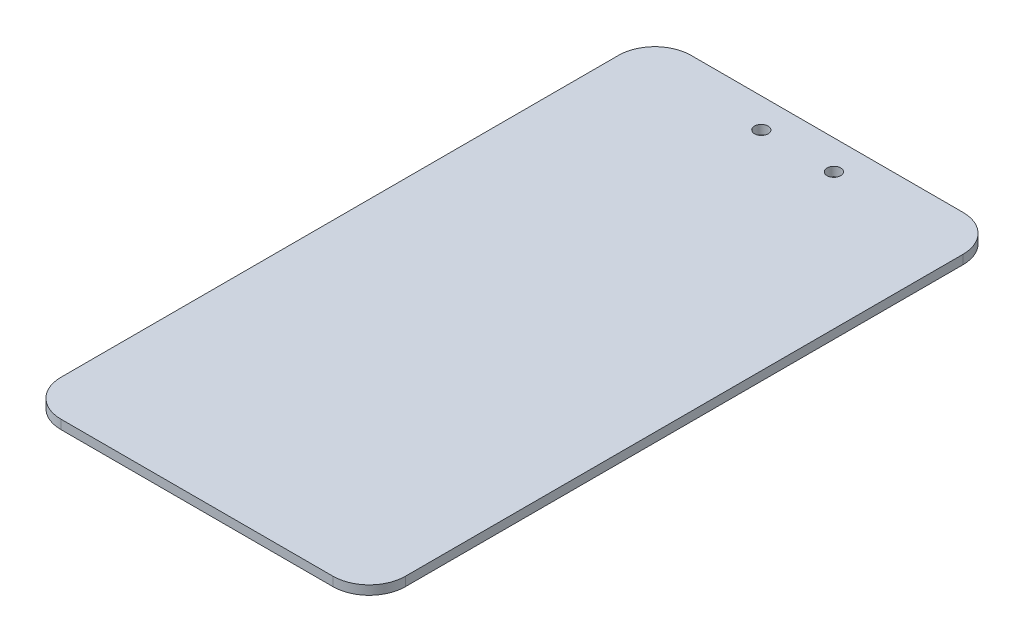
ISO-10303-21;
HEADER;
FILE_DESCRIPTION(('STEP AP214'),'2;1');
FILE_NAME('part.step','',(''),(''),'','','');
FILE_SCHEMA(('AUTOMOTIVE_DESIGN { 1 0 10303 214 1 1 1 1 }'));
ENDSEC;
DATA;
#1=APPLICATION_CONTEXT('core data for automotive mechanical design processes');
#2=APPLICATION_PROTOCOL_DEFINITION('international standard','automotive_design',2000,#1);
#3=PRODUCT_CONTEXT('',#1,'mechanical');
#4=PRODUCT('Part','Part','',(#3));
#5=PRODUCT_RELATED_PRODUCT_CATEGORY('part','',(#4));
#6=PRODUCT_DEFINITION_FORMATION('','',#4);
#7=PRODUCT_DEFINITION_CONTEXT('part definition',#1,'design');
#8=PRODUCT_DEFINITION('design','',#6,#7);
#9=PRODUCT_DEFINITION_SHAPE('','',#8);
#10=(LENGTH_UNIT() NAMED_UNIT(*) SI_UNIT(.MILLI.,.METRE.));
#11=(NAMED_UNIT(*) PLANE_ANGLE_UNIT() SI_UNIT($,.RADIAN.));
#12=(NAMED_UNIT(*) SI_UNIT($,.STERADIAN.) SOLID_ANGLE_UNIT());
#13=UNCERTAINTY_MEASURE_WITH_UNIT(LENGTH_MEASURE(1.E-05),#10,'distance_accuracy_value','');
#14=(GEOMETRIC_REPRESENTATION_CONTEXT(3) GLOBAL_UNCERTAINTY_ASSIGNED_CONTEXT((#13)) GLOBAL_UNIT_ASSIGNED_CONTEXT((#10,
#11,#12)) REPRESENTATION_CONTEXT('',''));
#15=CARTESIAN_POINT('',(0.,0.,0.));
#16=DIRECTION('',(0.,0.,1.));
#17=DIRECTION('',(1.,0.,0.));
#18=AXIS2_PLACEMENT_3D('',#15,#16,#17);
#19=CARTESIAN_POINT('',(8.,2.,-8.));
#20=DIRECTION('',(0.,-1.,0.));
#21=DIRECTION('',(0.,0.,-1.));
#22=AXIS2_PLACEMENT_3D('',#19,#20,#21);
#23=PLANE('',#22);
#24=CARTESIAN_POINT('',(8.,2.,-8.));
#25=DIRECTION('',(0.,1.,0.));
#26=DIRECTION('',(0.,0.,-1.));
#27=AXIS2_PLACEMENT_3D('',#24,#25,#26);
#28=CIRCLE('',#27,8.);
#29=CARTESIAN_POINT('',(0.,2.,-8.00000000000006));
#30=VERTEX_POINT('',#29);
#31=CARTESIAN_POINT('',(8.00000000000006,2.,0.));
#32=VERTEX_POINT('',#31);
#33=EDGE_CURVE('E170',#30,#32,#28,.T.);
#34=ORIENTED_EDGE('',*,*,#33,.T.);
#35=DIRECTION('',(1.,0.,0.));
#36=VECTOR('',#35,1.);
#37=CARTESIAN_POINT('',(8.00000000000006,2.,0.));
#38=LINE('',#37,#36);
#39=CARTESIAN_POINT('',(67.9999999999999,2.,0.));
#40=VERTEX_POINT('',#39);
#41=EDGE_CURVE('E106',#32,#40,#38,.T.);
#42=ORIENTED_EDGE('',*,*,#41,.T.);
#43=CARTESIAN_POINT('',(68.,2.,-8.));
#44=DIRECTION('',(0.,1.,0.));
#45=DIRECTION('',(0.,0.,1.));
#46=AXIS2_PLACEMENT_3D('',#43,#44,#45);
#47=CIRCLE('',#46,8.);
#48=CARTESIAN_POINT('',(76.,2.,-8.00000000000005));
#49=VERTEX_POINT('',#48);
#50=EDGE_CURVE('E191',#40,#49,#47,.T.);
#51=ORIENTED_EDGE('',*,*,#50,.T.);
#52=DIRECTION('',(0.,0.,-1.));
#53=VECTOR('',#52,1.);
#54=CARTESIAN_POINT('',(76.,2.,-8.00000000000006));
#55=LINE('',#54,#53);
#56=CARTESIAN_POINT('',(76.,2.,-131.));
#57=VERTEX_POINT('',#56);
#58=EDGE_CURVE('E205',#49,#57,#55,.T.);
#59=ORIENTED_EDGE('',*,*,#58,.T.);
#60=CARTESIAN_POINT('',(68.,2.,-131.));
#61=DIRECTION('',(0.,1.,0.));
#62=DIRECTION('',(0.,0.,-1.));
#63=AXIS2_PLACEMENT_3D('',#60,#61,#62);
#64=CIRCLE('',#63,8.);
#65=CARTESIAN_POINT('',(67.9999999999999,2.,-139.));
#66=VERTEX_POINT('',#65);
#67=EDGE_CURVE('E125',#57,#66,#64,.T.);
#68=ORIENTED_EDGE('',*,*,#67,.T.);
#69=DIRECTION('',(-1.,0.,0.));
#70=VECTOR('',#69,1.);
#71=CARTESIAN_POINT('',(8.00000000000006,2.,-139.));
#72=LINE('',#71,#70);
#73=CARTESIAN_POINT('',(8.00000000000006,2.,-139.));
#74=VERTEX_POINT('',#73);
#75=EDGE_CURVE('E119',#66,#74,#72,.T.);
#76=ORIENTED_EDGE('',*,*,#75,.T.);
#77=CARTESIAN_POINT('',(8.,2.,-131.));
#78=DIRECTION('',(0.,1.,0.));
#79=DIRECTION('',(0.,0.,-1.));
#80=AXIS2_PLACEMENT_3D('',#77,#78,#79);
#81=CIRCLE('',#80,8.);
#82=CARTESIAN_POINT('',(0.,2.,-131.));
#83=VERTEX_POINT('',#82);
#84=EDGE_CURVE('E123',#74,#83,#81,.T.);
#85=ORIENTED_EDGE('',*,*,#84,.T.);
#86=DIRECTION('',(0.,0.,1.));
#87=VECTOR('',#86,1.);
#88=CARTESIAN_POINT('',(0.,2.,-8.00000000000006));
#89=LINE('',#88,#87);
#90=EDGE_CURVE('E63',#83,#30,#89,.T.);
#91=ORIENTED_EDGE('',*,*,#90,.T.);
#92=EDGE_LOOP('',(#34,#42,#51,#59,#68,#76,#85,#91));
#93=FACE_BOUND('',#92,.T.);
#94=CARTESIAN_POINT('',(46.,2.,-132.5));
#95=DIRECTION('',(0.,1.,0.));
#96=DIRECTION('',(0.,0.,1.));
#97=AXIS2_PLACEMENT_3D('',#94,#95,#96);
#98=CIRCLE('',#97,1.5);
#99=CARTESIAN_POINT('',(46.,2.,-131.));
#100=VERTEX_POINT('',#99);
#101=EDGE_CURVE('E152',#100,#100,#98,.T.);
#102=ORIENTED_EDGE('',*,*,#101,.F.);
#103=EDGE_LOOP('',(#102));
#104=FACE_BOUND('',#103,.T.);
#105=CARTESIAN_POINT('',(30.,2.,-132.5));
#106=DIRECTION('',(0.,1.,0.));
#107=DIRECTION('',(0.,0.,-1.));
#108=AXIS2_PLACEMENT_3D('',#105,#106,#107);
#109=CIRCLE('',#108,1.5);
#110=CARTESIAN_POINT('',(30.,2.,-134.));
#111=VERTEX_POINT('',#110);
#112=EDGE_CURVE('E219',#111,#111,#109,.T.);
#113=ORIENTED_EDGE('',*,*,#112,.F.);
#114=EDGE_LOOP('',(#113));
#115=FACE_BOUND('',#114,.T.);
#116=ADVANCED_FACE('F45',(#93,#104,#115),#23,.F.);
#117=CARTESIAN_POINT('',(8.,0.,-8.));
#118=DIRECTION('',(0.,-1.,0.));
#119=DIRECTION('',(0.,0.,-1.));
#120=AXIS2_PLACEMENT_3D('',#117,#118,#119);
#121=PLANE('',#120);
#122=CARTESIAN_POINT('',(46.,0.,-132.5));
#123=DIRECTION('',(0.,1.,0.));
#124=DIRECTION('',(0.,0.,1.));
#125=AXIS2_PLACEMENT_3D('',#122,#123,#124);
#126=CIRCLE('',#125,1.5);
#127=CARTESIAN_POINT('',(46.,0.,-131.));
#128=VERTEX_POINT('',#127);
#129=EDGE_CURVE('E215',#128,#128,#126,.T.);
#130=ORIENTED_EDGE('',*,*,#129,.T.);
#131=EDGE_LOOP('',(#130));
#132=FACE_BOUND('',#131,.T.);
#133=CARTESIAN_POINT('',(8.,0.,-8.));
#134=DIRECTION('',(0.,1.,0.));
#135=DIRECTION('',(0.,0.,-1.));
#136=AXIS2_PLACEMENT_3D('',#133,#134,#135);
#137=CIRCLE('',#136,8.);
#138=CARTESIAN_POINT('',(0.,0.,-8.00000000000006));
#139=VERTEX_POINT('',#138);
#140=CARTESIAN_POINT('',(8.00000000000006,0.,0.));
#141=VERTEX_POINT('',#140);
#142=EDGE_CURVE('E147',#139,#141,#137,.T.);
#143=ORIENTED_EDGE('',*,*,#142,.F.);
#144=DIRECTION('',(0.,0.,1.));
#145=VECTOR('',#144,1.);
#146=CARTESIAN_POINT('',(0.,0.,-8.00000000000006));
#147=LINE('',#146,#145);
#148=CARTESIAN_POINT('',(0.,0.,-131.));
#149=VERTEX_POINT('',#148);
#150=EDGE_CURVE('E98',#149,#139,#147,.T.);
#151=ORIENTED_EDGE('',*,*,#150,.F.);
#152=CARTESIAN_POINT('',(8.,0.,-131.));
#153=DIRECTION('',(0.,1.,0.));
#154=DIRECTION('',(0.,0.,-1.));
#155=AXIS2_PLACEMENT_3D('',#152,#153,#154);
#156=CIRCLE('',#155,8.);
#157=CARTESIAN_POINT('',(8.00000000000006,0.,-139.));
#158=VERTEX_POINT('',#157);
#159=EDGE_CURVE('E92',#158,#149,#156,.T.);
#160=ORIENTED_EDGE('',*,*,#159,.F.);
#161=DIRECTION('',(-1.,0.,0.));
#162=VECTOR('',#161,1.);
#163=CARTESIAN_POINT('',(8.00000000000006,0.,-139.));
#164=LINE('',#163,#162);
#165=CARTESIAN_POINT('',(67.9999999999999,0.,-139.));
#166=VERTEX_POINT('',#165);
#167=EDGE_CURVE('E134',#166,#158,#164,.T.);
#168=ORIENTED_EDGE('',*,*,#167,.F.);
#169=CARTESIAN_POINT('',(68.,0.,-131.));
#170=DIRECTION('',(0.,1.,0.));
#171=DIRECTION('',(0.,0.,-1.));
#172=AXIS2_PLACEMENT_3D('',#169,#170,#171);
#173=CIRCLE('',#172,8.);
#174=CARTESIAN_POINT('',(76.,0.,-131.));
#175=VERTEX_POINT('',#174);
#176=EDGE_CURVE('E161',#175,#166,#173,.T.);
#177=ORIENTED_EDGE('',*,*,#176,.F.);
#178=DIRECTION('',(0.,0.,-1.));
#179=VECTOR('',#178,1.);
#180=CARTESIAN_POINT('',(76.,0.,-8.00000000000006));
#181=LINE('',#180,#179);
#182=CARTESIAN_POINT('',(76.,0.,-8.00000000000005));
#183=VERTEX_POINT('',#182);
#184=EDGE_CURVE('E158',#183,#175,#181,.T.);
#185=ORIENTED_EDGE('',*,*,#184,.F.);
#186=CARTESIAN_POINT('',(68.,0.,-8.));
#187=DIRECTION('',(0.,1.,0.));
#188=DIRECTION('',(0.,0.,1.));
#189=AXIS2_PLACEMENT_3D('',#186,#187,#188);
#190=CIRCLE('',#189,8.);
#191=CARTESIAN_POINT('',(67.9999999999999,0.,0.));
#192=VERTEX_POINT('',#191);
#193=EDGE_CURVE('E155',#192,#183,#190,.T.);
#194=ORIENTED_EDGE('',*,*,#193,.F.);
#195=DIRECTION('',(1.,0.,0.));
#196=VECTOR('',#195,1.);
#197=CARTESIAN_POINT('',(8.00000000000006,0.,0.));
#198=LINE('',#197,#196);
#199=EDGE_CURVE('E151',#141,#192,#198,.T.);
#200=ORIENTED_EDGE('',*,*,#199,.F.);
#201=EDGE_LOOP('',(#143,#151,#160,#168,#177,#185,#194,#200));
#202=FACE_BOUND('',#201,.T.);
#203=CARTESIAN_POINT('',(30.,0.,-132.5));
#204=DIRECTION('',(0.,1.,0.));
#205=DIRECTION('',(0.,0.,-1.));
#206=AXIS2_PLACEMENT_3D('',#203,#204,#205);
#207=CIRCLE('',#206,1.5);
#208=CARTESIAN_POINT('',(30.,0.,-134.));
#209=VERTEX_POINT('',#208);
#210=EDGE_CURVE('E223',#209,#209,#207,.T.);
#211=ORIENTED_EDGE('',*,*,#210,.T.);
#212=EDGE_LOOP('',(#211));
#213=FACE_BOUND('',#212,.T.);
#214=ADVANCED_FACE('F195',(#132,#202,#213),#121,.T.);
#215=CARTESIAN_POINT('',(8.,2.,-8.));
#216=DIRECTION('',(0.,-1.,0.));
#217=DIRECTION('',(0.,0.,-1.));
#218=AXIS2_PLACEMENT_3D('',#215,#216,#217);
#219=CYLINDRICAL_SURFACE('',#218,8.);
#220=ORIENTED_EDGE('',*,*,#142,.T.);
#221=DIRECTION('',(0.,-1.,0.));
#222=VECTOR('',#221,1.);
#223=CARTESIAN_POINT('',(8.00000000000006,2.,0.));
#224=LINE('',#223,#222);
#225=EDGE_CURVE('E11',#32,#141,#224,.T.);
#226=ORIENTED_EDGE('',*,*,#225,.F.);
#227=ORIENTED_EDGE('',*,*,#33,.F.);
#228=DIRECTION('',(0.,-1.,0.));
#229=VECTOR('',#228,1.);
#230=CARTESIAN_POINT('',(0.,2.,-8.00000000000006));
#231=LINE('',#230,#229);
#232=EDGE_CURVE('E143',#30,#139,#231,.T.);
#233=ORIENTED_EDGE('',*,*,#232,.T.);
#234=EDGE_LOOP('',(#220,#226,#227,#233));
#235=FACE_BOUND('',#234,.T.);
#236=ADVANCED_FACE('F47',(#235),#219,.T.);
#237=CARTESIAN_POINT('',(8.00000000000006,2.,0.));
#238=DIRECTION('',(0.,0.,-1.));
#239=DIRECTION('',(-1.,0.,0.));
#240=AXIS2_PLACEMENT_3D('',#237,#238,#239);
#241=PLANE('',#240);
#242=ORIENTED_EDGE('',*,*,#199,.T.);
#243=DIRECTION('',(0.,-1.,0.));
#244=VECTOR('',#243,1.);
#245=CARTESIAN_POINT('',(67.9999999999999,2.,0.));
#246=LINE('',#245,#244);
#247=EDGE_CURVE('E55',#40,#192,#246,.T.);
#248=ORIENTED_EDGE('',*,*,#247,.F.);
#249=ORIENTED_EDGE('',*,*,#41,.F.);
#250=ORIENTED_EDGE('',*,*,#225,.T.);
#251=EDGE_LOOP('',(#242,#248,#249,#250));
#252=FACE_BOUND('',#251,.T.);
#253=ADVANCED_FACE('F257',(#252),#241,.F.);
#254=CARTESIAN_POINT('',(68.,2.,-8.));
#255=DIRECTION('',(0.,-1.,0.));
#256=DIRECTION('',(0.,0.,-1.));
#257=AXIS2_PLACEMENT_3D('',#254,#255,#256);
#258=CYLINDRICAL_SURFACE('',#257,8.);
#259=ORIENTED_EDGE('',*,*,#193,.T.);
#260=DIRECTION('',(0.,-1.,0.));
#261=VECTOR('',#260,1.);
#262=CARTESIAN_POINT('',(76.,2.,-8.00000000000005));
#263=LINE('',#262,#261);
#264=EDGE_CURVE('E181',#49,#183,#263,.T.);
#265=ORIENTED_EDGE('',*,*,#264,.F.);
#266=ORIENTED_EDGE('',*,*,#50,.F.);
#267=ORIENTED_EDGE('',*,*,#247,.T.);
#268=EDGE_LOOP('',(#259,#265,#266,#267));
#269=FACE_BOUND('',#268,.T.);
#270=ADVANCED_FACE('F189',(#269),#258,.T.);
#271=CARTESIAN_POINT('',(76.,2.,-8.00000000000006));
#272=DIRECTION('',(-1.,0.,0.));
#273=DIRECTION('',(0.,0.,1.));
#274=AXIS2_PLACEMENT_3D('',#271,#272,#273);
#275=PLANE('',#274);
#276=ORIENTED_EDGE('',*,*,#184,.T.);
#277=DIRECTION('',(0.,-1.,0.));
#278=VECTOR('',#277,1.);
#279=CARTESIAN_POINT('',(76.,2.,-131.));
#280=LINE('',#279,#278);
#281=EDGE_CURVE('E177',#57,#175,#280,.T.);
#282=ORIENTED_EDGE('',*,*,#281,.F.);
#283=ORIENTED_EDGE('',*,*,#58,.F.);
#284=ORIENTED_EDGE('',*,*,#264,.T.);
#285=EDGE_LOOP('',(#276,#282,#283,#284));
#286=FACE_BOUND('',#285,.T.);
#287=ADVANCED_FACE('F200',(#286),#275,.F.);
#288=CARTESIAN_POINT('',(68.,2.,-131.));
#289=DIRECTION('',(0.,-1.,0.));
#290=DIRECTION('',(0.,0.,-1.));
#291=AXIS2_PLACEMENT_3D('',#288,#289,#290);
#292=CYLINDRICAL_SURFACE('',#291,8.);
#293=ORIENTED_EDGE('',*,*,#176,.T.);
#294=DIRECTION('',(0.,-1.,0.));
#295=VECTOR('',#294,1.);
#296=CARTESIAN_POINT('',(67.9999999999999,2.,-139.));
#297=LINE('',#296,#295);
#298=EDGE_CURVE('E136',#66,#166,#297,.T.);
#299=ORIENTED_EDGE('',*,*,#298,.F.);
#300=ORIENTED_EDGE('',*,*,#67,.F.);
#301=ORIENTED_EDGE('',*,*,#281,.T.);
#302=EDGE_LOOP('',(#293,#299,#300,#301));
#303=FACE_BOUND('',#302,.T.);
#304=ADVANCED_FACE('F203',(#303),#292,.T.);
#305=CARTESIAN_POINT('',(8.00000000000006,2.,-139.));
#306=DIRECTION('',(0.,0.,1.));
#307=DIRECTION('',(1.,0.,0.));
#308=AXIS2_PLACEMENT_3D('',#305,#306,#307);
#309=PLANE('',#308);
#310=ORIENTED_EDGE('',*,*,#167,.T.);
#311=DIRECTION('',(0.,-1.,0.));
#312=VECTOR('',#311,1.);
#313=CARTESIAN_POINT('',(8.00000000000006,2.,-139.));
#314=LINE('',#313,#312);
#315=EDGE_CURVE('E131',#74,#158,#314,.T.);
#316=ORIENTED_EDGE('',*,*,#315,.F.);
#317=ORIENTED_EDGE('',*,*,#75,.F.);
#318=ORIENTED_EDGE('',*,*,#298,.T.);
#319=EDGE_LOOP('',(#310,#316,#317,#318));
#320=FACE_BOUND('',#319,.T.);
#321=ADVANCED_FACE('F132',(#320),#309,.F.);
#322=CARTESIAN_POINT('',(8.,2.,-131.));
#323=DIRECTION('',(0.,-1.,0.));
#324=DIRECTION('',(0.,0.,-1.));
#325=AXIS2_PLACEMENT_3D('',#322,#323,#324);
#326=CYLINDRICAL_SURFACE('',#325,8.);
#327=ORIENTED_EDGE('',*,*,#159,.T.);
#328=DIRECTION('',(0.,-1.,0.));
#329=VECTOR('',#328,1.);
#330=CARTESIAN_POINT('',(0.,2.,-131.));
#331=LINE('',#330,#329);
#332=EDGE_CURVE('E137',#83,#149,#331,.T.);
#333=ORIENTED_EDGE('',*,*,#332,.F.);
#334=ORIENTED_EDGE('',*,*,#84,.F.);
#335=ORIENTED_EDGE('',*,*,#315,.T.);
#336=EDGE_LOOP('',(#327,#333,#334,#335));
#337=FACE_BOUND('',#336,.T.);
#338=ADVANCED_FACE('F139',(#337),#326,.T.);
#339=CARTESIAN_POINT('',(0.,2.,-8.00000000000006));
#340=DIRECTION('',(1.,0.,0.));
#341=DIRECTION('',(0.,0.,-1.));
#342=AXIS2_PLACEMENT_3D('',#339,#340,#341);
#343=PLANE('',#342);
#344=ORIENTED_EDGE('',*,*,#150,.T.);
#345=ORIENTED_EDGE('',*,*,#232,.F.);
#346=ORIENTED_EDGE('',*,*,#90,.F.);
#347=ORIENTED_EDGE('',*,*,#332,.T.);
#348=EDGE_LOOP('',(#344,#345,#346,#347));
#349=FACE_BOUND('',#348,.T.);
#350=ADVANCED_FACE('F245',(#349),#343,.F.);
#351=CARTESIAN_POINT('',(46.,2.,-132.5));
#352=DIRECTION('',(0.,-1.,0.));
#353=DIRECTION('',(0.,0.,-1.));
#354=AXIS2_PLACEMENT_3D('',#351,#352,#353);
#355=CYLINDRICAL_SURFACE('',#354,1.5);
#356=ORIENTED_EDGE('',*,*,#101,.T.);
#357=EDGE_LOOP('',(#356));
#358=FACE_BOUND('',#357,.T.);
#359=ORIENTED_EDGE('',*,*,#129,.F.);
#360=EDGE_LOOP('',(#359));
#361=FACE_BOUND('',#360,.T.);
#362=ADVANCED_FACE('F242',(#358,#361),#355,.F.);
#363=CARTESIAN_POINT('',(30.,2.,-132.5));
#364=DIRECTION('',(0.,-1.,0.));
#365=DIRECTION('',(0.,0.,-1.));
#366=AXIS2_PLACEMENT_3D('',#363,#364,#365);
#367=CYLINDRICAL_SURFACE('',#366,1.5);
#368=ORIENTED_EDGE('',*,*,#112,.T.);
#369=EDGE_LOOP('',(#368));
#370=FACE_BOUND('',#369,.T.);
#371=ORIENTED_EDGE('',*,*,#210,.F.);
#372=EDGE_LOOP('',(#371));
#373=FACE_BOUND('',#372,.T.);
#374=ADVANCED_FACE('F231',(#370,#373),#367,.F.);
#375=CLOSED_SHELL('',(#116,#214,#236,#253,#270,#287,#304,#321,#338,#350,#362,#374));
#376=MANIFOLD_SOLID_BREP('B2',#375);
#377=ADVANCED_BREP_SHAPE_REPRESENTATION('',(#18,#376),#14);
#378=SHAPE_DEFINITION_REPRESENTATION(#9,#377);
ENDSEC;
END-ISO-10303-21;
